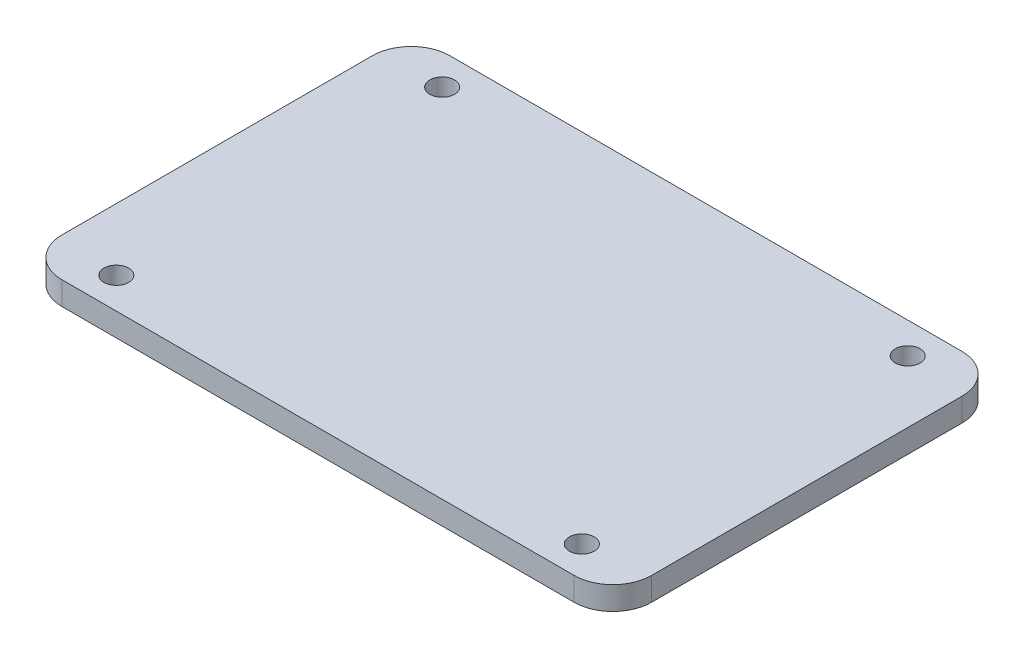
ISO-10303-21;
HEADER;
FILE_DESCRIPTION(('STEP AP214'),'2;1');
FILE_NAME('part.step','',(''),(''),'','','');
FILE_SCHEMA(('AUTOMOTIVE_DESIGN { 1 0 10303 214 1 1 1 1 }'));
ENDSEC;
DATA;
#1=APPLICATION_CONTEXT('core data for automotive mechanical design processes');
#2=APPLICATION_PROTOCOL_DEFINITION('international standard','automotive_design',2000,#1);
#3=PRODUCT_CONTEXT('',#1,'mechanical');
#4=PRODUCT('Part','Part','',(#3));
#5=PRODUCT_RELATED_PRODUCT_CATEGORY('part','',(#4));
#6=PRODUCT_DEFINITION_FORMATION('','',#4);
#7=PRODUCT_DEFINITION_CONTEXT('part definition',#1,'design');
#8=PRODUCT_DEFINITION('design','',#6,#7);
#9=PRODUCT_DEFINITION_SHAPE('','',#8);
#10=(LENGTH_UNIT() NAMED_UNIT(*) SI_UNIT(.MILLI.,.METRE.));
#11=(NAMED_UNIT(*) PLANE_ANGLE_UNIT() SI_UNIT($,.RADIAN.));
#12=(NAMED_UNIT(*) SI_UNIT($,.STERADIAN.) SOLID_ANGLE_UNIT());
#13=UNCERTAINTY_MEASURE_WITH_UNIT(LENGTH_MEASURE(1.E-05),#10,'distance_accuracy_value','');
#14=(GEOMETRIC_REPRESENTATION_CONTEXT(3) GLOBAL_UNCERTAINTY_ASSIGNED_CONTEXT((#13)) GLOBAL_UNIT_ASSIGNED_CONTEXT((#10,
#11,#12)) REPRESENTATION_CONTEXT('',''));
#15=CARTESIAN_POINT('',(0.,0.,0.));
#16=DIRECTION('',(0.,0.,1.));
#17=DIRECTION('',(1.,0.,0.));
#18=AXIS2_PLACEMENT_3D('',#15,#16,#17);
#19=CARTESIAN_POINT('',(33.,56.,-20.));
#20=DIRECTION('',(0.,1.,0.));
#21=DIRECTION('',(0.,0.,1.));
#22=AXIS2_PLACEMENT_3D('',#19,#20,#21);
#23=PLANE('',#22);
#24=CARTESIAN_POINT('',(30.,56.,21.));
#25=DIRECTION('',(0.,1.,0.));
#26=DIRECTION('',(0.,0.,1.));
#27=AXIS2_PLACEMENT_3D('',#24,#25,#26);
#28=CIRCLE('',#27,1.6);
#29=CARTESIAN_POINT('',(30.,56.,22.6));
#30=VERTEX_POINT('',#29);
#31=EDGE_CURVE('E188',#30,#30,#28,.T.);
#32=ORIENTED_EDGE('',*,*,#31,.F.);
#33=EDGE_LOOP('',(#32));
#34=FACE_BOUND('',#33,.T.);
#35=CARTESIAN_POINT('',(30.,56.,-21.));
#36=DIRECTION('',(0.,1.,0.));
#37=DIRECTION('',(0.,0.,1.));
#38=AXIS2_PLACEMENT_3D('',#35,#36,#37);
#39=CIRCLE('',#38,1.6);
#40=CARTESIAN_POINT('',(30.,56.,-19.4));
#41=VERTEX_POINT('',#40);
#42=EDGE_CURVE('E134',#41,#41,#39,.T.);
#43=ORIENTED_EDGE('',*,*,#42,.F.);
#44=EDGE_LOOP('',(#43));
#45=FACE_BOUND('',#44,.T.);
#46=CARTESIAN_POINT('',(33.,56.,-20.));
#47=DIRECTION('',(0.,1.,0.));
#48=DIRECTION('',(0.,0.,1.));
#49=AXIS2_PLACEMENT_3D('',#46,#47,#48);
#50=CIRCLE('',#49,5.);
#51=CARTESIAN_POINT('',(38.,56.,-20.));
#52=VERTEX_POINT('',#51);
#53=CARTESIAN_POINT('',(33.,56.,-25.));
#54=VERTEX_POINT('',#53);
#55=EDGE_CURVE('E145',#52,#54,#50,.T.);
#56=ORIENTED_EDGE('',*,*,#55,.T.);
#57=DIRECTION('',(-1.,0.,0.));
#58=VECTOR('',#57,1.);
#59=CARTESIAN_POINT('',(33.,56.,-25.));
#60=LINE('',#59,#58);
#61=CARTESIAN_POINT('',(-33.,56.,-25.));
#62=VERTEX_POINT('',#61);
#63=EDGE_CURVE('E93',#54,#62,#60,.T.);
#64=ORIENTED_EDGE('',*,*,#63,.T.);
#65=CARTESIAN_POINT('',(-33.,56.,-20.));
#66=DIRECTION('',(0.,1.,0.));
#67=DIRECTION('',(0.,0.,-1.));
#68=AXIS2_PLACEMENT_3D('',#65,#66,#67);
#69=CIRCLE('',#68,5.);
#70=CARTESIAN_POINT('',(-38.,56.,-20.));
#71=VERTEX_POINT('',#70);
#72=EDGE_CURVE('E160',#62,#71,#69,.T.);
#73=ORIENTED_EDGE('',*,*,#72,.T.);
#74=DIRECTION('',(0.,0.,1.));
#75=VECTOR('',#74,1.);
#76=CARTESIAN_POINT('',(-38.,56.,-20.));
#77=LINE('',#76,#75);
#78=CARTESIAN_POINT('',(-38.,56.,20.));
#79=VERTEX_POINT('',#78);
#80=EDGE_CURVE('E173',#71,#79,#77,.T.);
#81=ORIENTED_EDGE('',*,*,#80,.T.);
#82=CARTESIAN_POINT('',(-33.,56.,20.));
#83=DIRECTION('',(0.,1.,0.));
#84=DIRECTION('',(0.,0.,-1.));
#85=AXIS2_PLACEMENT_3D('',#82,#83,#84);
#86=CIRCLE('',#85,5.);
#87=CARTESIAN_POINT('',(-33.,56.,25.));
#88=VERTEX_POINT('',#87);
#89=EDGE_CURVE('E112',#79,#88,#86,.T.);
#90=ORIENTED_EDGE('',*,*,#89,.T.);
#91=DIRECTION('',(1.,0.,0.));
#92=VECTOR('',#91,1.);
#93=CARTESIAN_POINT('',(-33.,56.,25.));
#94=LINE('',#93,#92);
#95=CARTESIAN_POINT('',(33.,56.,25.));
#96=VERTEX_POINT('',#95);
#97=EDGE_CURVE('E106',#88,#96,#94,.T.);
#98=ORIENTED_EDGE('',*,*,#97,.T.);
#99=CARTESIAN_POINT('',(33.,56.,20.));
#100=DIRECTION('',(0.,1.,0.));
#101=DIRECTION('',(0.,0.,1.));
#102=AXIS2_PLACEMENT_3D('',#99,#100,#101);
#103=CIRCLE('',#102,5.);
#104=CARTESIAN_POINT('',(38.,56.,20.));
#105=VERTEX_POINT('',#104);
#106=EDGE_CURVE('E110',#96,#105,#103,.T.);
#107=ORIENTED_EDGE('',*,*,#106,.T.);
#108=DIRECTION('',(0.,0.,-1.));
#109=VECTOR('',#108,1.);
#110=CARTESIAN_POINT('',(38.,56.,20.));
#111=LINE('',#110,#109);
#112=EDGE_CURVE('E50',#105,#52,#111,.T.);
#113=ORIENTED_EDGE('',*,*,#112,.T.);
#114=EDGE_LOOP('',(#56,#64,#73,#81,#90,#98,#107,#113));
#115=FACE_BOUND('',#114,.T.);
#116=CARTESIAN_POINT('',(-30.,56.,-21.));
#117=DIRECTION('',(0.,1.,0.));
#118=DIRECTION('',(0.,0.,1.));
#119=AXIS2_PLACEMENT_3D('',#116,#117,#118);
#120=CIRCLE('',#119,1.6);
#121=CARTESIAN_POINT('',(-30.,56.,-19.4));
#122=VERTEX_POINT('',#121);
#123=EDGE_CURVE('E182',#122,#122,#120,.T.);
#124=ORIENTED_EDGE('',*,*,#123,.F.);
#125=EDGE_LOOP('',(#124));
#126=FACE_BOUND('',#125,.T.);
#127=CARTESIAN_POINT('',(-30.,56.,21.));
#128=DIRECTION('',(0.,1.,0.));
#129=DIRECTION('',(0.,0.,1.));
#130=AXIS2_PLACEMENT_3D('',#127,#128,#129);
#131=CIRCLE('',#130,1.6);
#132=CARTESIAN_POINT('',(-30.,56.,22.6));
#133=VERTEX_POINT('',#132);
#134=EDGE_CURVE('E194',#133,#133,#131,.T.);
#135=ORIENTED_EDGE('',*,*,#134,.F.);
#136=EDGE_LOOP('',(#135));
#137=FACE_BOUND('',#136,.T.);
#138=ADVANCED_FACE('F33',(#34,#45,#115,#126,#137),#23,.T.);
#139=CARTESIAN_POINT('',(33.,53.,-20.));
#140=DIRECTION('',(0.,1.,0.));
#141=DIRECTION('',(0.,0.,1.));
#142=AXIS2_PLACEMENT_3D('',#139,#140,#141);
#143=PLANE('',#142);
#144=CARTESIAN_POINT('',(33.,53.,-20.));
#145=DIRECTION('',(0.,1.,0.));
#146=DIRECTION('',(0.,0.,1.));
#147=AXIS2_PLACEMENT_3D('',#144,#145,#146);
#148=CIRCLE('',#147,5.);
#149=CARTESIAN_POINT('',(38.,53.,-20.));
#150=VERTEX_POINT('',#149);
#151=CARTESIAN_POINT('',(33.,53.,-25.));
#152=VERTEX_POINT('',#151);
#153=EDGE_CURVE('E130',#150,#152,#148,.T.);
#154=ORIENTED_EDGE('',*,*,#153,.F.);
#155=DIRECTION('',(0.,0.,-1.));
#156=VECTOR('',#155,1.);
#157=CARTESIAN_POINT('',(38.,53.,20.));
#158=LINE('',#157,#156);
#159=CARTESIAN_POINT('',(38.,53.,20.));
#160=VERTEX_POINT('',#159);
#161=EDGE_CURVE('E85',#160,#150,#158,.T.);
#162=ORIENTED_EDGE('',*,*,#161,.F.);
#163=CARTESIAN_POINT('',(33.,53.,20.));
#164=DIRECTION('',(0.,1.,0.));
#165=DIRECTION('',(0.,0.,1.));
#166=AXIS2_PLACEMENT_3D('',#163,#164,#165);
#167=CIRCLE('',#166,5.);
#168=CARTESIAN_POINT('',(33.,53.,25.));
#169=VERTEX_POINT('',#168);
#170=EDGE_CURVE('E79',#169,#160,#167,.T.);
#171=ORIENTED_EDGE('',*,*,#170,.F.);
#172=DIRECTION('',(1.,0.,0.));
#173=VECTOR('',#172,1.);
#174=CARTESIAN_POINT('',(-33.,53.,25.));
#175=LINE('',#174,#173);
#176=CARTESIAN_POINT('',(-33.,53.,25.));
#177=VERTEX_POINT('',#176);
#178=EDGE_CURVE('E120',#177,#169,#175,.T.);
#179=ORIENTED_EDGE('',*,*,#178,.F.);
#180=CARTESIAN_POINT('',(-33.,53.,20.));
#181=DIRECTION('',(0.,1.,0.));
#182=DIRECTION('',(0.,0.,-1.));
#183=AXIS2_PLACEMENT_3D('',#180,#181,#182);
#184=CIRCLE('',#183,5.);
#185=CARTESIAN_POINT('',(-38.,53.,20.));
#186=VERTEX_POINT('',#185);
#187=EDGE_CURVE('E140',#186,#177,#184,.T.);
#188=ORIENTED_EDGE('',*,*,#187,.F.);
#189=DIRECTION('',(0.,0.,1.));
#190=VECTOR('',#189,1.);
#191=CARTESIAN_POINT('',(-38.,53.,-20.));
#192=LINE('',#191,#190);
#193=CARTESIAN_POINT('',(-38.,53.,-20.));
#194=VERTEX_POINT('',#193);
#195=EDGE_CURVE('E138',#194,#186,#192,.T.);
#196=ORIENTED_EDGE('',*,*,#195,.F.);
#197=CARTESIAN_POINT('',(-33.,53.,-20.));
#198=DIRECTION('',(0.,1.,0.));
#199=DIRECTION('',(0.,0.,-1.));
#200=AXIS2_PLACEMENT_3D('',#197,#198,#199);
#201=CIRCLE('',#200,5.);
#202=CARTESIAN_POINT('',(-33.,53.,-25.));
#203=VERTEX_POINT('',#202);
#204=EDGE_CURVE('E136',#203,#194,#201,.T.);
#205=ORIENTED_EDGE('',*,*,#204,.F.);
#206=DIRECTION('',(-1.,0.,0.));
#207=VECTOR('',#206,1.);
#208=CARTESIAN_POINT('',(33.,53.,-25.));
#209=LINE('',#208,#207);
#210=EDGE_CURVE('E133',#152,#203,#209,.T.);
#211=ORIENTED_EDGE('',*,*,#210,.F.);
#212=EDGE_LOOP('',(#154,#162,#171,#179,#188,#196,#205,#211));
#213=FACE_BOUND('',#212,.T.);
#214=CARTESIAN_POINT('',(30.,53.,-21.));
#215=DIRECTION('',(0.,1.,0.));
#216=DIRECTION('',(0.,0.,1.));
#217=AXIS2_PLACEMENT_3D('',#214,#215,#216);
#218=CIRCLE('',#217,1.6);
#219=CARTESIAN_POINT('',(30.,53.,-19.4));
#220=VERTEX_POINT('',#219);
#221=EDGE_CURVE('E179',#220,#220,#218,.T.);
#222=ORIENTED_EDGE('',*,*,#221,.T.);
#223=EDGE_LOOP('',(#222));
#224=FACE_BOUND('',#223,.T.);
#225=CARTESIAN_POINT('',(-30.,53.,-21.));
#226=DIRECTION('',(0.,1.,0.));
#227=DIRECTION('',(0.,0.,1.));
#228=AXIS2_PLACEMENT_3D('',#225,#226,#227);
#229=CIRCLE('',#228,1.6);
#230=CARTESIAN_POINT('',(-30.,53.,-19.4));
#231=VERTEX_POINT('',#230);
#232=EDGE_CURVE('E185',#231,#231,#229,.T.);
#233=ORIENTED_EDGE('',*,*,#232,.T.);
#234=EDGE_LOOP('',(#233));
#235=FACE_BOUND('',#234,.T.);
#236=CARTESIAN_POINT('',(30.,53.,21.));
#237=DIRECTION('',(0.,1.,0.));
#238=DIRECTION('',(0.,0.,1.));
#239=AXIS2_PLACEMENT_3D('',#236,#237,#238);
#240=CIRCLE('',#239,1.6);
#241=CARTESIAN_POINT('',(30.,53.,22.6));
#242=VERTEX_POINT('',#241);
#243=EDGE_CURVE('E191',#242,#242,#240,.T.);
#244=ORIENTED_EDGE('',*,*,#243,.T.);
#245=EDGE_LOOP('',(#244));
#246=FACE_BOUND('',#245,.T.);
#247=CARTESIAN_POINT('',(-30.,53.,21.));
#248=DIRECTION('',(0.,1.,0.));
#249=DIRECTION('',(0.,0.,1.));
#250=AXIS2_PLACEMENT_3D('',#247,#248,#249);
#251=CIRCLE('',#250,1.6);
#252=CARTESIAN_POINT('',(-30.,53.,22.6));
#253=VERTEX_POINT('',#252);
#254=EDGE_CURVE('E197',#253,#253,#251,.T.);
#255=ORIENTED_EDGE('',*,*,#254,.T.);
#256=EDGE_LOOP('',(#255));
#257=FACE_BOUND('',#256,.T.);
#258=ADVANCED_FACE('F164',(#213,#224,#235,#246,#257),#143,.F.);
#259=CARTESIAN_POINT('',(33.,56.,-20.));
#260=DIRECTION('',(0.,-1.,0.));
#261=DIRECTION('',(0.,0.,-1.));
#262=AXIS2_PLACEMENT_3D('',#259,#260,#261);
#263=CYLINDRICAL_SURFACE('',#262,5.);
#264=ORIENTED_EDGE('',*,*,#153,.T.);
#265=DIRECTION('',(0.,-1.,0.));
#266=VECTOR('',#265,1.);
#267=CARTESIAN_POINT('',(33.,56.,-25.));
#268=LINE('',#267,#266);
#269=EDGE_CURVE('E11',#54,#152,#268,.T.);
#270=ORIENTED_EDGE('',*,*,#269,.F.);
#271=ORIENTED_EDGE('',*,*,#55,.F.);
#272=DIRECTION('',(0.,-1.,0.));
#273=VECTOR('',#272,1.);
#274=CARTESIAN_POINT('',(38.,56.,-20.));
#275=LINE('',#274,#273);
#276=EDGE_CURVE('E126',#52,#150,#275,.T.);
#277=ORIENTED_EDGE('',*,*,#276,.T.);
#278=EDGE_LOOP('',(#264,#270,#271,#277));
#279=FACE_BOUND('',#278,.T.);
#280=ADVANCED_FACE('F35',(#279),#263,.T.);
#281=CARTESIAN_POINT('',(33.,56.,-25.));
#282=DIRECTION('',(0.,0.,1.));
#283=DIRECTION('',(1.,0.,0.));
#284=AXIS2_PLACEMENT_3D('',#281,#282,#283);
#285=PLANE('',#284);
#286=ORIENTED_EDGE('',*,*,#210,.T.);
#287=DIRECTION('',(0.,-1.,0.));
#288=VECTOR('',#287,1.);
#289=CARTESIAN_POINT('',(-33.,56.,-25.));
#290=LINE('',#289,#288);
#291=EDGE_CURVE('E42',#62,#203,#290,.T.);
#292=ORIENTED_EDGE('',*,*,#291,.F.);
#293=ORIENTED_EDGE('',*,*,#63,.F.);
#294=ORIENTED_EDGE('',*,*,#269,.T.);
#295=EDGE_LOOP('',(#286,#292,#293,#294));
#296=FACE_BOUND('',#295,.T.);
#297=ADVANCED_FACE('F231',(#296),#285,.F.);
#298=CARTESIAN_POINT('',(-33.,56.,-20.));
#299=DIRECTION('',(0.,-1.,0.));
#300=DIRECTION('',(0.,0.,-1.));
#301=AXIS2_PLACEMENT_3D('',#298,#299,#300);
#302=CYLINDRICAL_SURFACE('',#301,5.);
#303=ORIENTED_EDGE('',*,*,#204,.T.);
#304=DIRECTION('',(0.,-1.,0.));
#305=VECTOR('',#304,1.);
#306=CARTESIAN_POINT('',(-38.,56.,-20.));
#307=LINE('',#306,#305);
#308=EDGE_CURVE('E152',#71,#194,#307,.T.);
#309=ORIENTED_EDGE('',*,*,#308,.F.);
#310=ORIENTED_EDGE('',*,*,#72,.F.);
#311=ORIENTED_EDGE('',*,*,#291,.T.);
#312=EDGE_LOOP('',(#303,#309,#310,#311));
#313=FACE_BOUND('',#312,.T.);
#314=ADVANCED_FACE('F158',(#313),#302,.T.);
#315=CARTESIAN_POINT('',(-38.,56.,-20.));
#316=DIRECTION('',(1.,0.,0.));
#317=DIRECTION('',(0.,0.,-1.));
#318=AXIS2_PLACEMENT_3D('',#315,#316,#317);
#319=PLANE('',#318);
#320=ORIENTED_EDGE('',*,*,#195,.T.);
#321=DIRECTION('',(0.,-1.,0.));
#322=VECTOR('',#321,1.);
#323=CARTESIAN_POINT('',(-38.,56.,20.));
#324=LINE('',#323,#322);
#325=EDGE_CURVE('E149',#79,#186,#324,.T.);
#326=ORIENTED_EDGE('',*,*,#325,.F.);
#327=ORIENTED_EDGE('',*,*,#80,.F.);
#328=ORIENTED_EDGE('',*,*,#308,.T.);
#329=EDGE_LOOP('',(#320,#326,#327,#328));
#330=FACE_BOUND('',#329,.T.);
#331=ADVANCED_FACE('F169',(#330),#319,.F.);
#332=CARTESIAN_POINT('',(-33.,56.,20.));
#333=DIRECTION('',(0.,-1.,0.));
#334=DIRECTION('',(0.,0.,-1.));
#335=AXIS2_PLACEMENT_3D('',#332,#333,#334);
#336=CYLINDRICAL_SURFACE('',#335,5.);
#337=ORIENTED_EDGE('',*,*,#187,.T.);
#338=DIRECTION('',(0.,-1.,0.));
#339=VECTOR('',#338,1.);
#340=CARTESIAN_POINT('',(-33.,56.,25.));
#341=LINE('',#340,#339);
#342=EDGE_CURVE('E121',#88,#177,#341,.T.);
#343=ORIENTED_EDGE('',*,*,#342,.F.);
#344=ORIENTED_EDGE('',*,*,#89,.F.);
#345=ORIENTED_EDGE('',*,*,#325,.T.);
#346=EDGE_LOOP('',(#337,#343,#344,#345));
#347=FACE_BOUND('',#346,.T.);
#348=ADVANCED_FACE('F172',(#347),#336,.T.);
#349=CARTESIAN_POINT('',(-33.,56.,25.));
#350=DIRECTION('',(0.,0.,-1.));
#351=DIRECTION('',(-1.,0.,0.));
#352=AXIS2_PLACEMENT_3D('',#349,#350,#351);
#353=PLANE('',#352);
#354=ORIENTED_EDGE('',*,*,#178,.T.);
#355=DIRECTION('',(0.,-1.,0.));
#356=VECTOR('',#355,1.);
#357=CARTESIAN_POINT('',(33.,56.,25.));
#358=LINE('',#357,#356);
#359=EDGE_CURVE('E117',#96,#169,#358,.T.);
#360=ORIENTED_EDGE('',*,*,#359,.F.);
#361=ORIENTED_EDGE('',*,*,#97,.F.);
#362=ORIENTED_EDGE('',*,*,#342,.T.);
#363=EDGE_LOOP('',(#354,#360,#361,#362));
#364=FACE_BOUND('',#363,.T.);
#365=ADVANCED_FACE('F118',(#364),#353,.F.);
#366=CARTESIAN_POINT('',(33.,56.,20.));
#367=DIRECTION('',(0.,-1.,0.));
#368=DIRECTION('',(0.,0.,-1.));
#369=AXIS2_PLACEMENT_3D('',#366,#367,#368);
#370=CYLINDRICAL_SURFACE('',#369,5.);
#371=ORIENTED_EDGE('',*,*,#170,.T.);
#372=DIRECTION('',(0.,-1.,0.));
#373=VECTOR('',#372,1.);
#374=CARTESIAN_POINT('',(38.,56.,20.));
#375=LINE('',#374,#373);
#376=EDGE_CURVE('E122',#105,#160,#375,.T.);
#377=ORIENTED_EDGE('',*,*,#376,.F.);
#378=ORIENTED_EDGE('',*,*,#106,.F.);
#379=ORIENTED_EDGE('',*,*,#359,.T.);
#380=EDGE_LOOP('',(#371,#377,#378,#379));
#381=FACE_BOUND('',#380,.T.);
#382=ADVANCED_FACE('F124',(#381),#370,.T.);
#383=CARTESIAN_POINT('',(38.,56.,20.));
#384=DIRECTION('',(-1.,0.,0.));
#385=DIRECTION('',(0.,0.,1.));
#386=AXIS2_PLACEMENT_3D('',#383,#384,#385);
#387=PLANE('',#386);
#388=ORIENTED_EDGE('',*,*,#161,.T.);
#389=ORIENTED_EDGE('',*,*,#276,.F.);
#390=ORIENTED_EDGE('',*,*,#112,.F.);
#391=ORIENTED_EDGE('',*,*,#376,.T.);
#392=EDGE_LOOP('',(#388,#389,#390,#391));
#393=FACE_BOUND('',#392,.T.);
#394=ADVANCED_FACE('F219',(#393),#387,.F.);
#395=CARTESIAN_POINT('',(30.,56.,-21.));
#396=DIRECTION('',(0.,-1.,0.));
#397=DIRECTION('',(0.,0.,-1.));
#398=AXIS2_PLACEMENT_3D('',#395,#396,#397);
#399=CYLINDRICAL_SURFACE('',#398,1.6);
#400=ORIENTED_EDGE('',*,*,#42,.T.);
#401=EDGE_LOOP('',(#400));
#402=FACE_BOUND('',#401,.T.);
#403=ORIENTED_EDGE('',*,*,#221,.F.);
#404=EDGE_LOOP('',(#403));
#405=FACE_BOUND('',#404,.T.);
#406=ADVANCED_FACE('F216',(#402,#405),#399,.F.);
#407=CARTESIAN_POINT('',(-30.,56.,-21.));
#408=DIRECTION('',(0.,-1.,0.));
#409=DIRECTION('',(0.,0.,-1.));
#410=AXIS2_PLACEMENT_3D('',#407,#408,#409);
#411=CYLINDRICAL_SURFACE('',#410,1.6);
#412=ORIENTED_EDGE('',*,*,#123,.T.);
#413=EDGE_LOOP('',(#412));
#414=FACE_BOUND('',#413,.T.);
#415=ORIENTED_EDGE('',*,*,#232,.F.);
#416=EDGE_LOOP('',(#415));
#417=FACE_BOUND('',#416,.T.);
#418=ADVANCED_FACE('F295',(#414,#417),#411,.F.);
#419=CARTESIAN_POINT('',(30.,56.,21.));
#420=DIRECTION('',(0.,-1.,0.));
#421=DIRECTION('',(0.,0.,-1.));
#422=AXIS2_PLACEMENT_3D('',#419,#420,#421);
#423=CYLINDRICAL_SURFACE('',#422,1.6);
#424=ORIENTED_EDGE('',*,*,#31,.T.);
#425=EDGE_LOOP('',(#424));
#426=FACE_BOUND('',#425,.T.);
#427=ORIENTED_EDGE('',*,*,#243,.F.);
#428=EDGE_LOOP('',(#427));
#429=FACE_BOUND('',#428,.T.);
#430=ADVANCED_FACE('F303',(#426,#429),#423,.F.);
#431=CARTESIAN_POINT('',(-30.,56.,21.));
#432=DIRECTION('',(0.,-1.,0.));
#433=DIRECTION('',(0.,0.,-1.));
#434=AXIS2_PLACEMENT_3D('',#431,#432,#433);
#435=CYLINDRICAL_SURFACE('',#434,1.6);
#436=ORIENTED_EDGE('',*,*,#134,.T.);
#437=EDGE_LOOP('',(#436));
#438=FACE_BOUND('',#437,.T.);
#439=ORIENTED_EDGE('',*,*,#254,.F.);
#440=EDGE_LOOP('',(#439));
#441=FACE_BOUND('',#440,.T.);
#442=ADVANCED_FACE('F203',(#438,#441),#435,.F.);
#443=CLOSED_SHELL('',(#138,#258,#280,#297,#314,#331,#348,#365,#382,#394,#406,#418,#430,#442));
#444=MANIFOLD_SOLID_BREP('B2',#443);
#445=ADVANCED_BREP_SHAPE_REPRESENTATION('',(#18,#444),#14);
#446=SHAPE_DEFINITION_REPRESENTATION(#9,#445);
ENDSEC;
END-ISO-10303-21;
